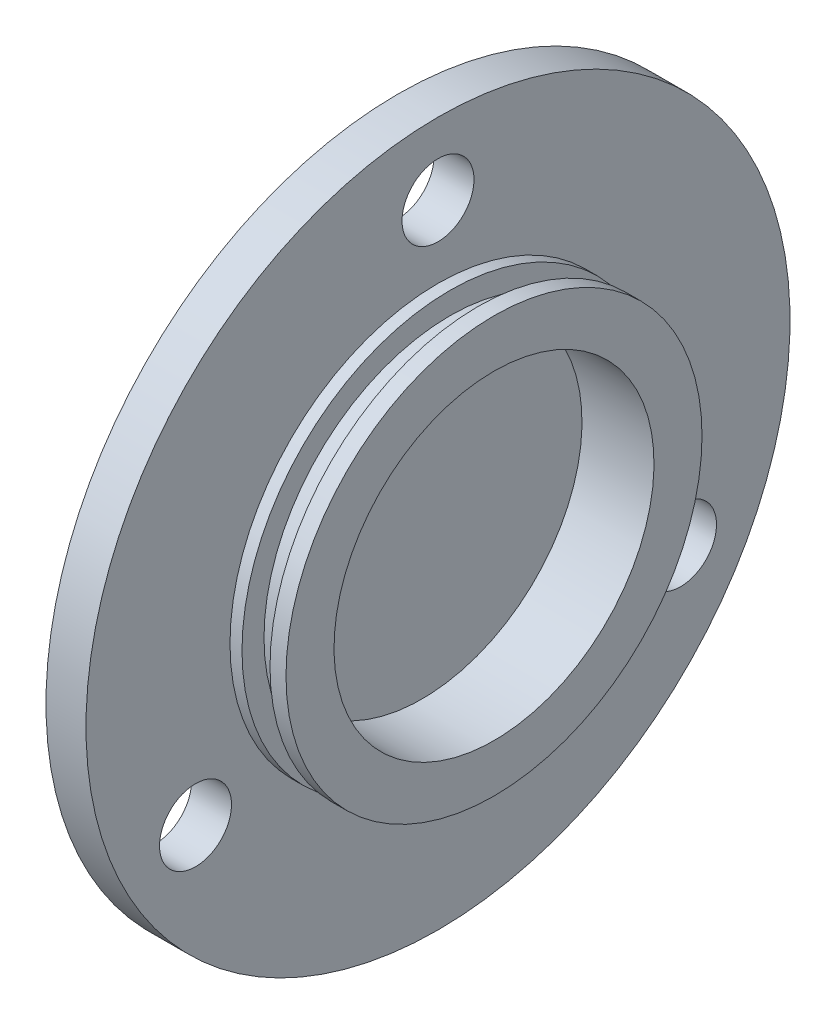
ISO-10303-21;
HEADER;
FILE_DESCRIPTION(('STEP AP214'),'2;1');
FILE_NAME('part.step','',(''),(''),'','','');
FILE_SCHEMA(('AUTOMOTIVE_DESIGN { 1 0 10303 214 1 1 1 1 }'));
ENDSEC;
DATA;
#1=APPLICATION_CONTEXT('core data for automotive mechanical design processes');
#2=APPLICATION_PROTOCOL_DEFINITION('international standard','automotive_design',2000,#1);
#3=PRODUCT_CONTEXT('',#1,'mechanical');
#4=PRODUCT('Part','Part','',(#3));
#5=PRODUCT_RELATED_PRODUCT_CATEGORY('part','',(#4));
#6=PRODUCT_DEFINITION_FORMATION('','',#4);
#7=PRODUCT_DEFINITION_CONTEXT('part definition',#1,'design');
#8=PRODUCT_DEFINITION('design','',#6,#7);
#9=PRODUCT_DEFINITION_SHAPE('','',#8);
#10=(LENGTH_UNIT() NAMED_UNIT(*) SI_UNIT(.MILLI.,.METRE.));
#11=(NAMED_UNIT(*) PLANE_ANGLE_UNIT() SI_UNIT($,.RADIAN.));
#12=(NAMED_UNIT(*) SI_UNIT($,.STERADIAN.) SOLID_ANGLE_UNIT());
#13=UNCERTAINTY_MEASURE_WITH_UNIT(LENGTH_MEASURE(1.E-05),#10,'distance_accuracy_value','');
#14=(GEOMETRIC_REPRESENTATION_CONTEXT(3) GLOBAL_UNCERTAINTY_ASSIGNED_CONTEXT((#13)) GLOBAL_UNIT_ASSIGNED_CONTEXT((#10,
#11,#12)) REPRESENTATION_CONTEXT('',''));
#15=CARTESIAN_POINT('',(0.,0.,0.));
#16=DIRECTION('',(0.,0.,1.));
#17=DIRECTION('',(1.,0.,0.));
#18=AXIS2_PLACEMENT_3D('',#15,#16,#17);
#19=CARTESIAN_POINT('',(0.,0.,0.));
#20=DIRECTION('',(-1.,0.,0.));
#21=DIRECTION('',(0.,-1.,0.));
#22=AXIS2_PLACEMENT_3D('',#19,#20,#21);
#23=PLANE('',#22);
#24=CARTESIAN_POINT('',(0.,35.,0.));
#25=DIRECTION('',(1.,0.,0.));
#26=DIRECTION('',(0.,1.,0.));
#27=AXIS2_PLACEMENT_3D('',#24,#25,#26);
#28=CIRCLE('',#27,4.5);
#29=CARTESIAN_POINT('',(0.,39.5,0.));
#30=VERTEX_POINT('',#29);
#31=EDGE_CURVE('E68',#30,#30,#28,.T.);
#32=ORIENTED_EDGE('',*,*,#31,.T.);
#33=EDGE_LOOP('',(#32));
#34=FACE_BOUND('',#33,.T.);
#35=CARTESIAN_POINT('',(0.,-17.499999999999,-30.3108891324571));
#36=DIRECTION('',(1.,0.,0.));
#37=DIRECTION('',(0.,1.,0.));
#38=AXIS2_PLACEMENT_3D('',#35,#36,#37);
#39=CIRCLE('',#38,4.5);
#40=CARTESIAN_POINT('',(0.,-12.999999999999,-30.3108891324571));
#41=VERTEX_POINT('',#40);
#42=EDGE_CURVE('E78',#41,#41,#39,.T.);
#43=ORIENTED_EDGE('',*,*,#42,.T.);
#44=EDGE_LOOP('',(#43));
#45=FACE_BOUND('',#44,.T.);
#46=CARTESIAN_POINT('',(0.,-17.500000000001,30.3108891324537));
#47=DIRECTION('',(1.,0.,0.));
#48=DIRECTION('',(0.,1.,0.));
#49=AXIS2_PLACEMENT_3D('',#46,#47,#48);
#50=CIRCLE('',#49,4.5);
#51=CARTESIAN_POINT('',(0.,-13.000000000001,30.3108891324537));
#52=VERTEX_POINT('',#51);
#53=EDGE_CURVE('E72',#52,#52,#50,.T.);
#54=ORIENTED_EDGE('',*,*,#53,.T.);
#55=EDGE_LOOP('',(#54));
#56=FACE_BOUND('',#55,.T.);
#57=CARTESIAN_POINT('',(0.,0.,0.));
#58=DIRECTION('',(1.,0.,0.));
#59=DIRECTION('',(0.,1.,0.));
#60=AXIS2_PLACEMENT_3D('',#57,#58,#59);
#61=CIRCLE('',#60,44.);
#62=CARTESIAN_POINT('',(0.,44.,0.));
#63=VERTEX_POINT('',#62);
#64=EDGE_CURVE('E10',#63,#63,#61,.T.);
#65=ORIENTED_EDGE('',*,*,#64,.F.);
#66=EDGE_LOOP('',(#65));
#67=FACE_BOUND('',#66,.T.);
#68=ADVANCED_FACE('F31',(#34,#45,#56,#67),#23,.T.);
#69=CARTESIAN_POINT('',(3.,0.,0.));
#70=DIRECTION('',(1.,0.,0.));
#71=DIRECTION('',(0.,1.,0.));
#72=AXIS2_PLACEMENT_3D('',#69,#70,#71);
#73=CYLINDRICAL_SURFACE('',#72,44.);
#74=ORIENTED_EDGE('',*,*,#64,.T.);
#75=EDGE_LOOP('',(#74));
#76=FACE_BOUND('',#75,.T.);
#77=CARTESIAN_POINT('',(5.,0.,0.));
#78=DIRECTION('',(1.,0.,0.));
#79=DIRECTION('',(0.,1.,0.));
#80=AXIS2_PLACEMENT_3D('',#77,#78,#79);
#81=CIRCLE('',#80,44.);
#82=CARTESIAN_POINT('',(5.,44.,0.));
#83=VERTEX_POINT('',#82);
#84=EDGE_CURVE('E37',#83,#83,#81,.T.);
#85=ORIENTED_EDGE('',*,*,#84,.F.);
#86=EDGE_LOOP('',(#85));
#87=FACE_BOUND('',#86,.T.);
#88=ADVANCED_FACE('F100',(#76,#87),#73,.T.);
#89=CARTESIAN_POINT('',(5.,44.,0.));
#90=DIRECTION('',(1.,0.,0.));
#91=DIRECTION('',(0.,1.,0.));
#92=AXIS2_PLACEMENT_3D('',#89,#90,#91);
#93=PLANE('',#92);
#94=CARTESIAN_POINT('',(5.,35.,0.));
#95=DIRECTION('',(1.,0.,0.));
#96=DIRECTION('',(0.,1.,0.));
#97=AXIS2_PLACEMENT_3D('',#94,#95,#96);
#98=CIRCLE('',#97,4.5);
#99=CARTESIAN_POINT('',(5.,39.5,0.));
#100=VERTEX_POINT('',#99);
#101=EDGE_CURVE('E81',#100,#100,#98,.T.);
#102=ORIENTED_EDGE('',*,*,#101,.F.);
#103=EDGE_LOOP('',(#102));
#104=FACE_BOUND('',#103,.T.);
#105=CARTESIAN_POINT('',(5.00000000000001,-17.499999999999,-30.3108891324571));
#106=DIRECTION('',(1.,0.,0.));
#107=DIRECTION('',(0.,1.,0.));
#108=AXIS2_PLACEMENT_3D('',#105,#106,#107);
#109=CIRCLE('',#108,4.5);
#110=CARTESIAN_POINT('',(5.00000000000001,-12.999999999999,-30.3108891324571));
#111=VERTEX_POINT('',#110);
#112=EDGE_CURVE('E75',#111,#111,#109,.T.);
#113=ORIENTED_EDGE('',*,*,#112,.F.);
#114=EDGE_LOOP('',(#113));
#115=FACE_BOUND('',#114,.T.);
#116=CARTESIAN_POINT('',(5.00000000000001,-17.500000000001,30.3108891324537));
#117=DIRECTION('',(1.,0.,0.));
#118=DIRECTION('',(0.,1.,0.));
#119=AXIS2_PLACEMENT_3D('',#116,#117,#118);
#120=CIRCLE('',#119,4.5);
#121=CARTESIAN_POINT('',(5.00000000000001,-13.000000000001,30.3108891324537));
#122=VERTEX_POINT('',#121);
#123=EDGE_CURVE('E69',#122,#122,#120,.T.);
#124=ORIENTED_EDGE('',*,*,#123,.F.);
#125=EDGE_LOOP('',(#124));
#126=FACE_BOUND('',#125,.T.);
#127=ORIENTED_EDGE('',*,*,#84,.T.);
#128=EDGE_LOOP('',(#127));
#129=FACE_BOUND('',#128,.T.);
#130=CARTESIAN_POINT('',(5.,0.,0.));
#131=DIRECTION('',(1.,0.,0.));
#132=DIRECTION('',(0.,1.,0.));
#133=AXIS2_PLACEMENT_3D('',#130,#131,#132);
#134=CIRCLE('',#133,26.);
#135=CARTESIAN_POINT('',(5.,26.,0.));
#136=VERTEX_POINT('',#135);
#137=EDGE_CURVE('E41',#136,#136,#134,.T.);
#138=ORIENTED_EDGE('',*,*,#137,.F.);
#139=EDGE_LOOP('',(#138));
#140=FACE_BOUND('',#139,.T.);
#141=ADVANCED_FACE('F96',(#104,#115,#126,#129,#140),#93,.T.);
#142=CARTESIAN_POINT('',(3.,0.,0.));
#143=DIRECTION('',(1.,0.,0.));
#144=DIRECTION('',(0.,1.,0.));
#145=AXIS2_PLACEMENT_3D('',#142,#143,#144);
#146=CYLINDRICAL_SURFACE('',#145,26.);
#147=ORIENTED_EDGE('',*,*,#137,.T.);
#148=EDGE_LOOP('',(#147));
#149=FACE_BOUND('',#148,.T.);
#150=CARTESIAN_POINT('',(6.5,0.,0.));
#151=DIRECTION('',(1.,0.,0.));
#152=DIRECTION('',(0.,1.,0.));
#153=AXIS2_PLACEMENT_3D('',#150,#151,#152);
#154=CIRCLE('',#153,26.);
#155=CARTESIAN_POINT('',(6.5,26.,0.));
#156=VERTEX_POINT('',#155);
#157=EDGE_CURVE('E45',#156,#156,#154,.T.);
#158=ORIENTED_EDGE('',*,*,#157,.F.);
#159=EDGE_LOOP('',(#158));
#160=FACE_BOUND('',#159,.T.);
#161=ADVANCED_FACE('F99',(#149,#160),#146,.T.);
#162=CARTESIAN_POINT('',(6.5,26.,0.));
#163=DIRECTION('',(1.,0.,0.));
#164=DIRECTION('',(0.,1.,0.));
#165=AXIS2_PLACEMENT_3D('',#162,#163,#164);
#166=PLANE('',#165);
#167=ORIENTED_EDGE('',*,*,#157,.T.);
#168=EDGE_LOOP('',(#167));
#169=FACE_BOUND('',#168,.T.);
#170=CARTESIAN_POINT('',(6.5,0.,0.));
#171=DIRECTION('',(1.,0.,0.));
#172=DIRECTION('',(0.,1.,0.));
#173=AXIS2_PLACEMENT_3D('',#170,#171,#172);
#174=CIRCLE('',#173,23.25);
#175=CARTESIAN_POINT('',(6.5,23.25,0.));
#176=VERTEX_POINT('',#175);
#177=EDGE_CURVE('E50',#176,#176,#174,.T.);
#178=ORIENTED_EDGE('',*,*,#177,.F.);
#179=EDGE_LOOP('',(#178));
#180=FACE_BOUND('',#179,.T.);
#181=ADVANCED_FACE('F110',(#169,#180),#166,.T.);
#182=CARTESIAN_POINT('',(3.,0.,0.));
#183=DIRECTION('',(1.,0.,0.));
#184=DIRECTION('',(0.,1.,0.));
#185=AXIS2_PLACEMENT_3D('',#182,#183,#184);
#186=CYLINDRICAL_SURFACE('',#185,23.25);
#187=ORIENTED_EDGE('',*,*,#177,.T.);
#188=EDGE_LOOP('',(#187));
#189=FACE_BOUND('',#188,.T.);
#190=CARTESIAN_POINT('',(10.,0.,0.));
#191=DIRECTION('',(1.,0.,0.));
#192=DIRECTION('',(0.,1.,0.));
#193=AXIS2_PLACEMENT_3D('',#190,#191,#192);
#194=CIRCLE('',#193,23.25);
#195=CARTESIAN_POINT('',(10.,23.25,0.));
#196=VERTEX_POINT('',#195);
#197=EDGE_CURVE('E53',#196,#196,#194,.T.);
#198=ORIENTED_EDGE('',*,*,#197,.F.);
#199=EDGE_LOOP('',(#198));
#200=FACE_BOUND('',#199,.T.);
#201=ADVANCED_FACE('F116',(#189,#200),#186,.T.);
#202=CARTESIAN_POINT('',(10.,23.25,0.));
#203=DIRECTION('',(-1.,0.,0.));
#204=DIRECTION('',(0.,-1.,0.));
#205=AXIS2_PLACEMENT_3D('',#202,#203,#204);
#206=PLANE('',#205);
#207=ORIENTED_EDGE('',*,*,#197,.T.);
#208=EDGE_LOOP('',(#207));
#209=FACE_BOUND('',#208,.T.);
#210=CARTESIAN_POINT('',(10.,0.,0.));
#211=DIRECTION('',(1.,0.,0.));
#212=DIRECTION('',(0.,1.,0.));
#213=AXIS2_PLACEMENT_3D('',#210,#211,#212);
#214=CIRCLE('',#213,26.);
#215=CARTESIAN_POINT('',(10.,26.,0.));
#216=VERTEX_POINT('',#215);
#217=EDGE_CURVE('E56',#216,#216,#214,.T.);
#218=ORIENTED_EDGE('',*,*,#217,.F.);
#219=EDGE_LOOP('',(#218));
#220=FACE_BOUND('',#219,.T.);
#221=ADVANCED_FACE('F122',(#209,#220),#206,.T.);
#222=CARTESIAN_POINT('',(3.,0.,0.));
#223=DIRECTION('',(1.,0.,0.));
#224=DIRECTION('',(0.,1.,0.));
#225=AXIS2_PLACEMENT_3D('',#222,#223,#224);
#226=CYLINDRICAL_SURFACE('',#225,26.);
#227=ORIENTED_EDGE('',*,*,#217,.T.);
#228=EDGE_LOOP('',(#227));
#229=FACE_BOUND('',#228,.T.);
#230=CARTESIAN_POINT('',(12.,0.,0.));
#231=DIRECTION('',(1.,0.,0.));
#232=DIRECTION('',(0.,1.,0.));
#233=AXIS2_PLACEMENT_3D('',#230,#231,#232);
#234=CIRCLE('',#233,26.);
#235=CARTESIAN_POINT('',(12.,26.,0.));
#236=VERTEX_POINT('',#235);
#237=EDGE_CURVE('E59',#236,#236,#234,.T.);
#238=ORIENTED_EDGE('',*,*,#237,.F.);
#239=EDGE_LOOP('',(#238));
#240=FACE_BOUND('',#239,.T.);
#241=ADVANCED_FACE('F128',(#229,#240),#226,.T.);
#242=CARTESIAN_POINT('',(12.,26.,0.));
#243=DIRECTION('',(1.,0.,0.));
#244=DIRECTION('',(0.,1.,0.));
#245=AXIS2_PLACEMENT_3D('',#242,#243,#244);
#246=PLANE('',#245);
#247=ORIENTED_EDGE('',*,*,#237,.T.);
#248=EDGE_LOOP('',(#247));
#249=FACE_BOUND('',#248,.T.);
#250=CARTESIAN_POINT('',(12.,0.,0.));
#251=DIRECTION('',(1.,0.,0.));
#252=DIRECTION('',(0.,1.,0.));
#253=AXIS2_PLACEMENT_3D('',#250,#251,#252);
#254=CIRCLE('',#253,20.);
#255=CARTESIAN_POINT('',(12.,20.,0.));
#256=VERTEX_POINT('',#255);
#257=EDGE_CURVE('E62',#256,#256,#254,.T.);
#258=ORIENTED_EDGE('',*,*,#257,.F.);
#259=EDGE_LOOP('',(#258));
#260=FACE_BOUND('',#259,.T.);
#261=ADVANCED_FACE('F134',(#249,#260),#246,.T.);
#262=CARTESIAN_POINT('',(3.,0.,0.));
#263=DIRECTION('',(1.,0.,0.));
#264=DIRECTION('',(0.,1.,0.));
#265=AXIS2_PLACEMENT_3D('',#262,#263,#264);
#266=CYLINDRICAL_SURFACE('',#265,20.);
#267=ORIENTED_EDGE('',*,*,#257,.T.);
#268=EDGE_LOOP('',(#267));
#269=FACE_BOUND('',#268,.T.);
#270=CARTESIAN_POINT('',(3.,0.,0.));
#271=DIRECTION('',(1.,0.,0.));
#272=DIRECTION('',(0.,1.,0.));
#273=AXIS2_PLACEMENT_3D('',#270,#271,#272);
#274=CIRCLE('',#273,20.);
#275=CARTESIAN_POINT('',(3.,20.,0.));
#276=VERTEX_POINT('',#275);
#277=EDGE_CURVE('E65',#276,#276,#274,.T.);
#278=ORIENTED_EDGE('',*,*,#277,.F.);
#279=EDGE_LOOP('',(#278));
#280=FACE_BOUND('',#279,.T.);
#281=ADVANCED_FACE('F140',(#269,#280),#266,.F.);
#282=CARTESIAN_POINT('',(3.,20.,0.));
#283=DIRECTION('',(1.,0.,0.));
#284=DIRECTION('',(0.,1.,0.));
#285=AXIS2_PLACEMENT_3D('',#282,#283,#284);
#286=PLANE('',#285);
#287=ORIENTED_EDGE('',*,*,#277,.T.);
#288=EDGE_LOOP('',(#287));
#289=FACE_BOUND('',#288,.T.);
#290=ADVANCED_FACE('F146',(#289),#286,.T.);
#291=CARTESIAN_POINT('',(0.,-17.500000000001,30.3108891324537));
#292=DIRECTION('',(1.,0.,0.));
#293=DIRECTION('',(0.,1.,0.));
#294=AXIS2_PLACEMENT_3D('',#291,#292,#293);
#295=CYLINDRICAL_SURFACE('',#294,4.5);
#296=ORIENTED_EDGE('',*,*,#53,.F.);
#297=EDGE_LOOP('',(#296));
#298=FACE_BOUND('',#297,.T.);
#299=ORIENTED_EDGE('',*,*,#123,.T.);
#300=EDGE_LOOP('',(#299));
#301=FACE_BOUND('',#300,.T.);
#302=ADVANCED_FACE('F151',(#298,#301),#295,.F.);
#303=CARTESIAN_POINT('',(0.,-17.499999999999,-30.3108891324571));
#304=DIRECTION('',(1.,0.,0.));
#305=DIRECTION('',(0.,1.,0.));
#306=AXIS2_PLACEMENT_3D('',#303,#304,#305);
#307=CYLINDRICAL_SURFACE('',#306,4.5);
#308=ORIENTED_EDGE('',*,*,#42,.F.);
#309=EDGE_LOOP('',(#308));
#310=FACE_BOUND('',#309,.T.);
#311=ORIENTED_EDGE('',*,*,#112,.T.);
#312=EDGE_LOOP('',(#311));
#313=FACE_BOUND('',#312,.T.);
#314=ADVANCED_FACE('F92',(#310,#313),#307,.F.);
#315=CARTESIAN_POINT('',(0.,35.,0.));
#316=DIRECTION('',(1.,0.,0.));
#317=DIRECTION('',(0.,1.,0.));
#318=AXIS2_PLACEMENT_3D('',#315,#316,#317);
#319=CYLINDRICAL_SURFACE('',#318,4.5);
#320=ORIENTED_EDGE('',*,*,#31,.F.);
#321=EDGE_LOOP('',(#320));
#322=FACE_BOUND('',#321,.T.);
#323=ORIENTED_EDGE('',*,*,#101,.T.);
#324=EDGE_LOOP('',(#323));
#325=FACE_BOUND('',#324,.T.);
#326=ADVANCED_FACE('F89',(#322,#325),#319,.F.);
#327=CLOSED_SHELL('',(#68,#88,#141,#161,#181,#201,#221,#241,#261,#281,#290,#302,#314,#326));
#328=MANIFOLD_SOLID_BREP('B2',#327);
#329=ADVANCED_BREP_SHAPE_REPRESENTATION('',(#18,#328),#14);
#330=SHAPE_DEFINITION_REPRESENTATION(#9,#329);
ENDSEC;
END-ISO-10303-21;
